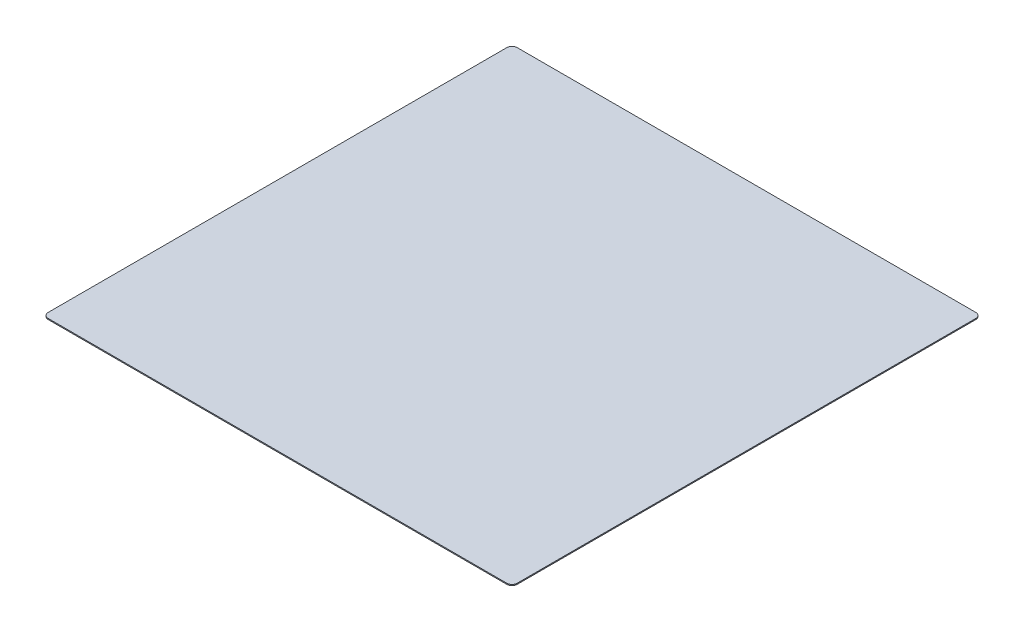
ISO-10303-21;
HEADER;
FILE_DESCRIPTION(('STEP AP214'),'2;1');
FILE_NAME('part.step','',(''),(''),'','','');
FILE_SCHEMA(('AUTOMOTIVE_DESIGN { 1 0 10303 214 1 1 1 1 }'));
ENDSEC;
DATA;
#1=APPLICATION_CONTEXT('core data for automotive mechanical design processes');
#2=APPLICATION_PROTOCOL_DEFINITION('international standard','automotive_design',2000,#1);
#3=PRODUCT_CONTEXT('',#1,'mechanical');
#4=PRODUCT('Part','Part','',(#3));
#5=PRODUCT_RELATED_PRODUCT_CATEGORY('part','',(#4));
#6=PRODUCT_DEFINITION_FORMATION('','',#4);
#7=PRODUCT_DEFINITION_CONTEXT('part definition',#1,'design');
#8=PRODUCT_DEFINITION('design','',#6,#7);
#9=PRODUCT_DEFINITION_SHAPE('','',#8);
#10=(LENGTH_UNIT() NAMED_UNIT(*) SI_UNIT(.MILLI.,.METRE.));
#11=(NAMED_UNIT(*) PLANE_ANGLE_UNIT() SI_UNIT($,.RADIAN.));
#12=(NAMED_UNIT(*) SI_UNIT($,.STERADIAN.) SOLID_ANGLE_UNIT());
#13=UNCERTAINTY_MEASURE_WITH_UNIT(LENGTH_MEASURE(1.E-05),#10,'distance_accuracy_value','');
#14=(GEOMETRIC_REPRESENTATION_CONTEXT(3) GLOBAL_UNCERTAINTY_ASSIGNED_CONTEXT((#13)) GLOBAL_UNIT_ASSIGNED_CONTEXT((#10,
#11,#12)) REPRESENTATION_CONTEXT('',''));
#15=CARTESIAN_POINT('',(0.,0.,0.));
#16=DIRECTION('',(0.,0.,1.));
#17=DIRECTION('',(1.,0.,0.));
#18=AXIS2_PLACEMENT_3D('',#15,#16,#17);
#19=CARTESIAN_POINT('',(68.349999952,0.15,68.349999952));
#20=DIRECTION('',(-1.,0.,0.));
#21=DIRECTION('',(0.,0.,1.));
#22=AXIS2_PLACEMENT_3D('',#19,#20,#21);
#23=PLANE('',#22);
#24=DIRECTION('',(0.,0.,-1.));
#25=VECTOR('',#24,1.);
#26=CARTESIAN_POINT('',(68.349999952,-0.15,68.349999952));
#27=LINE('',#26,#25);
#28=CARTESIAN_POINT('',(68.349999952,-0.15,66.849999952));
#29=VERTEX_POINT('',#28);
#30=CARTESIAN_POINT('',(68.349999952,-0.15,-66.849999952));
#31=VERTEX_POINT('',#30);
#32=EDGE_CURVE('E159',#29,#31,#27,.T.);
#33=ORIENTED_EDGE('',*,*,#32,.T.);
#34=DIRECTION('',(0.,-1.,0.));
#35=VECTOR('',#34,1.);
#36=CARTESIAN_POINT('',(68.349999952,0.15,-66.849999952));
#37=LINE('',#36,#35);
#38=CARTESIAN_POINT('',(68.349999952,0.15,-66.849999952));
#39=VERTEX_POINT('',#38);
#40=EDGE_CURVE('E11',#31,#39,#37,.F.);
#41=ORIENTED_EDGE('',*,*,#40,.T.);
#42=DIRECTION('',(0.,0.,-1.));
#43=VECTOR('',#42,1.);
#44=CARTESIAN_POINT('',(68.349999952,0.15,68.349999952));
#45=LINE('',#44,#43);
#46=CARTESIAN_POINT('',(68.349999952,0.15,66.849999952));
#47=VERTEX_POINT('',#46);
#48=EDGE_CURVE('E127',#47,#39,#45,.T.);
#49=ORIENTED_EDGE('',*,*,#48,.F.);
#50=DIRECTION('',(0.,-1.,0.));
#51=VECTOR('',#50,1.);
#52=CARTESIAN_POINT('',(68.349999952,0.15,66.849999952));
#53=LINE('',#52,#51);
#54=EDGE_CURVE('E43',#47,#29,#53,.T.);
#55=ORIENTED_EDGE('',*,*,#54,.T.);
#56=EDGE_LOOP('',(#33,#41,#49,#55));
#57=FACE_BOUND('',#56,.T.);
#58=ADVANCED_FACE('F35',(#57),#23,.F.);
#59=CARTESIAN_POINT('',(-68.349999952,0.15,-68.349999952));
#60=DIRECTION('',(0.,0.,1.));
#61=DIRECTION('',(1.,0.,0.));
#62=AXIS2_PLACEMENT_3D('',#59,#60,#61);
#63=PLANE('',#62);
#64=DIRECTION('',(-1.,0.,0.));
#65=VECTOR('',#64,1.);
#66=CARTESIAN_POINT('',(-68.349999952,-0.15,-68.349999952));
#67=LINE('',#66,#65);
#68=CARTESIAN_POINT('',(66.849999952,-0.15,-68.349999952));
#69=VERTEX_POINT('',#68);
#70=CARTESIAN_POINT('',(-66.849999952,-0.15,-68.349999952));
#71=VERTEX_POINT('',#70);
#72=EDGE_CURVE('E132',#69,#71,#67,.T.);
#73=ORIENTED_EDGE('',*,*,#72,.T.);
#74=DIRECTION('',(0.,-1.,0.));
#75=VECTOR('',#74,1.);
#76=CARTESIAN_POINT('',(-66.849999952,0.15,-68.349999952));
#77=LINE('',#76,#75);
#78=CARTESIAN_POINT('',(-66.849999952,0.15,-68.349999952));
#79=VERTEX_POINT('',#78);
#80=EDGE_CURVE('E50',#71,#79,#77,.F.);
#81=ORIENTED_EDGE('',*,*,#80,.T.);
#82=DIRECTION('',(-1.,0.,0.));
#83=VECTOR('',#82,1.);
#84=CARTESIAN_POINT('',(-68.349999952,0.15,-68.349999952));
#85=LINE('',#84,#83);
#86=CARTESIAN_POINT('',(66.849999952,0.15,-68.349999952));
#87=VERTEX_POINT('',#86);
#88=EDGE_CURVE('E130',#87,#79,#85,.T.);
#89=ORIENTED_EDGE('',*,*,#88,.F.);
#90=DIRECTION('',(0.,-1.,0.));
#91=VECTOR('',#90,1.);
#92=CARTESIAN_POINT('',(66.849999952,0.15,-68.349999952));
#93=LINE('',#92,#91);
#94=EDGE_CURVE('E151',#87,#69,#93,.T.);
#95=ORIENTED_EDGE('',*,*,#94,.T.);
#96=EDGE_LOOP('',(#73,#81,#89,#95));
#97=FACE_BOUND('',#96,.T.);
#98=ADVANCED_FACE('F179',(#97),#63,.F.);
#99=CARTESIAN_POINT('',(-68.349999952,0.15,68.349999952));
#100=DIRECTION('',(1.,0.,0.));
#101=DIRECTION('',(0.,0.,-1.));
#102=AXIS2_PLACEMENT_3D('',#99,#100,#101);
#103=PLANE('',#102);
#104=DIRECTION('',(0.,0.,1.));
#105=VECTOR('',#104,1.);
#106=CARTESIAN_POINT('',(-68.349999952,-0.15,68.349999952));
#107=LINE('',#106,#105);
#108=CARTESIAN_POINT('',(-68.349999952,-0.15,-66.849999952));
#109=VERTEX_POINT('',#108);
#110=CARTESIAN_POINT('',(-68.349999952,-0.15,66.849999952));
#111=VERTEX_POINT('',#110);
#112=EDGE_CURVE('E128',#109,#111,#107,.T.);
#113=ORIENTED_EDGE('',*,*,#112,.T.);
#114=DIRECTION('',(0.,-1.,0.));
#115=VECTOR('',#114,1.);
#116=CARTESIAN_POINT('',(-68.349999952,0.15,66.849999952));
#117=LINE('',#116,#115);
#118=CARTESIAN_POINT('',(-68.349999952,0.15,66.849999952));
#119=VERTEX_POINT('',#118);
#120=EDGE_CURVE('E106',#111,#119,#117,.F.);
#121=ORIENTED_EDGE('',*,*,#120,.T.);
#122=DIRECTION('',(0.,0.,1.));
#123=VECTOR('',#122,1.);
#124=CARTESIAN_POINT('',(-68.349999952,0.15,68.349999952));
#125=LINE('',#124,#123);
#126=CARTESIAN_POINT('',(-68.349999952,0.15,-66.849999952));
#127=VERTEX_POINT('',#126);
#128=EDGE_CURVE('E167',#127,#119,#125,.T.);
#129=ORIENTED_EDGE('',*,*,#128,.F.);
#130=DIRECTION('',(0.,-1.,0.));
#131=VECTOR('',#130,1.);
#132=CARTESIAN_POINT('',(-68.349999952,0.15,-66.849999952));
#133=LINE('',#132,#131);
#134=EDGE_CURVE('E111',#127,#109,#133,.T.);
#135=ORIENTED_EDGE('',*,*,#134,.T.);
#136=EDGE_LOOP('',(#113,#121,#129,#135));
#137=FACE_BOUND('',#136,.T.);
#138=ADVANCED_FACE('F178',(#137),#103,.F.);
#139=CARTESIAN_POINT('',(-68.349999952,0.15,68.349999952));
#140=DIRECTION('',(0.,0.,-1.));
#141=DIRECTION('',(-1.,0.,0.));
#142=AXIS2_PLACEMENT_3D('',#139,#140,#141);
#143=PLANE('',#142);
#144=DIRECTION('',(1.,0.,0.));
#145=VECTOR('',#144,1.);
#146=CARTESIAN_POINT('',(-68.349999952,0.15,68.349999952));
#147=LINE('',#146,#145);
#148=CARTESIAN_POINT('',(-66.849999952,0.15,68.349999952));
#149=VERTEX_POINT('',#148);
#150=CARTESIAN_POINT('',(66.849999952,0.15,68.349999952));
#151=VERTEX_POINT('',#150);
#152=EDGE_CURVE('E121',#149,#151,#147,.T.);
#153=ORIENTED_EDGE('',*,*,#152,.F.);
#154=DIRECTION('',(0.,-1.,0.));
#155=VECTOR('',#154,1.);
#156=CARTESIAN_POINT('',(-66.849999952,0.15,68.349999952));
#157=LINE('',#156,#155);
#158=CARTESIAN_POINT('',(-66.849999952,-0.15,68.349999952));
#159=VERTEX_POINT('',#158);
#160=EDGE_CURVE('E105',#149,#159,#157,.T.);
#161=ORIENTED_EDGE('',*,*,#160,.T.);
#162=DIRECTION('',(1.,0.,0.));
#163=VECTOR('',#162,1.);
#164=CARTESIAN_POINT('',(-68.349999952,-0.15,68.349999952));
#165=LINE('',#164,#163);
#166=CARTESIAN_POINT('',(66.849999952,-0.15,68.349999952));
#167=VERTEX_POINT('',#166);
#168=EDGE_CURVE('E118',#159,#167,#165,.T.);
#169=ORIENTED_EDGE('',*,*,#168,.T.);
#170=DIRECTION('',(0.,-1.,0.));
#171=VECTOR('',#170,1.);
#172=CARTESIAN_POINT('',(66.849999952,0.15,68.349999952));
#173=LINE('',#172,#171);
#174=EDGE_CURVE('E123',#167,#151,#173,.F.);
#175=ORIENTED_EDGE('',*,*,#174,.T.);
#176=EDGE_LOOP('',(#153,#161,#169,#175));
#177=FACE_BOUND('',#176,.T.);
#178=ADVANCED_FACE('F117',(#177),#143,.F.);
#179=CARTESIAN_POINT('',(0.,0.15,0.));
#180=DIRECTION('',(0.,-1.,0.));
#181=DIRECTION('',(0.,0.,-1.));
#182=AXIS2_PLACEMENT_3D('',#179,#180,#181);
#183=PLANE('',#182);
#184=ORIENTED_EDGE('',*,*,#128,.T.);
#185=CARTESIAN_POINT('',(-66.849999952,0.15,66.849999952));
#186=DIRECTION('',(0.,-1.,0.));
#187=DIRECTION('',(0.,0.,-1.));
#188=AXIS2_PLACEMENT_3D('',#185,#186,#187);
#189=CIRCLE('',#188,1.5);
#190=EDGE_CURVE('E149',#119,#149,#189,.F.);
#191=ORIENTED_EDGE('',*,*,#190,.T.);
#192=ORIENTED_EDGE('',*,*,#152,.T.);
#193=CARTESIAN_POINT('',(66.849999952,0.15,66.849999952));
#194=DIRECTION('',(0.,-1.,0.));
#195=DIRECTION('',(0.,0.,-1.));
#196=AXIS2_PLACEMENT_3D('',#193,#194,#195);
#197=CIRCLE('',#196,1.5);
#198=EDGE_CURVE('E144',#151,#47,#197,.F.);
#199=ORIENTED_EDGE('',*,*,#198,.T.);
#200=ORIENTED_EDGE('',*,*,#48,.T.);
#201=CARTESIAN_POINT('',(66.849999952,0.15,-66.849999952));
#202=DIRECTION('',(0.,-1.,0.));
#203=DIRECTION('',(0.,0.,-1.));
#204=AXIS2_PLACEMENT_3D('',#201,#202,#203);
#205=CIRCLE('',#204,1.5);
#206=EDGE_CURVE('E57',#39,#87,#205,.F.);
#207=ORIENTED_EDGE('',*,*,#206,.T.);
#208=ORIENTED_EDGE('',*,*,#88,.T.);
#209=CARTESIAN_POINT('',(-66.849999952,0.15,-66.849999952));
#210=DIRECTION('',(0.,-1.,0.));
#211=DIRECTION('',(0.,0.,-1.));
#212=AXIS2_PLACEMENT_3D('',#209,#210,#211);
#213=CIRCLE('',#212,1.5);
#214=EDGE_CURVE('E147',#79,#127,#213,.F.);
#215=ORIENTED_EDGE('',*,*,#214,.T.);
#216=EDGE_LOOP('',(#184,#191,#192,#199,#200,#207,#208,#215));
#217=FACE_BOUND('',#216,.T.);
#218=ADVANCED_FACE('F171',(#217),#183,.F.);
#219=CARTESIAN_POINT('',(0.,-0.15,0.));
#220=DIRECTION('',(0.,-1.,0.));
#221=DIRECTION('',(0.,0.,-1.));
#222=AXIS2_PLACEMENT_3D('',#219,#220,#221);
#223=PLANE('',#222);
#224=ORIENTED_EDGE('',*,*,#168,.F.);
#225=CARTESIAN_POINT('',(-66.849999952,-0.15,66.849999952));
#226=DIRECTION('',(0.,-1.,0.));
#227=DIRECTION('',(0.,0.,-1.));
#228=AXIS2_PLACEMENT_3D('',#225,#226,#227);
#229=CIRCLE('',#228,1.5);
#230=EDGE_CURVE('E101',#159,#111,#229,.T.);
#231=ORIENTED_EDGE('',*,*,#230,.T.);
#232=ORIENTED_EDGE('',*,*,#112,.F.);
#233=CARTESIAN_POINT('',(-66.849999952,-0.15,-66.849999952));
#234=DIRECTION('',(0.,-1.,0.));
#235=DIRECTION('',(0.,0.,-1.));
#236=AXIS2_PLACEMENT_3D('',#233,#234,#235);
#237=CIRCLE('',#236,1.5);
#238=EDGE_CURVE('E112',#109,#71,#237,.T.);
#239=ORIENTED_EDGE('',*,*,#238,.T.);
#240=ORIENTED_EDGE('',*,*,#72,.F.);
#241=CARTESIAN_POINT('',(66.849999952,-0.15,-66.849999952));
#242=DIRECTION('',(0.,-1.,0.));
#243=DIRECTION('',(0.,0.,-1.));
#244=AXIS2_PLACEMENT_3D('',#241,#242,#243);
#245=CIRCLE('',#244,1.5);
#246=EDGE_CURVE('E138',#69,#31,#245,.T.);
#247=ORIENTED_EDGE('',*,*,#246,.T.);
#248=ORIENTED_EDGE('',*,*,#32,.F.);
#249=CARTESIAN_POINT('',(66.849999952,-0.15,66.849999952));
#250=DIRECTION('',(0.,-1.,0.));
#251=DIRECTION('',(0.,0.,-1.));
#252=AXIS2_PLACEMENT_3D('',#249,#250,#251);
#253=CIRCLE('',#252,1.5);
#254=EDGE_CURVE('E122',#29,#167,#253,.T.);
#255=ORIENTED_EDGE('',*,*,#254,.T.);
#256=EDGE_LOOP('',(#224,#231,#232,#239,#240,#247,#248,#255));
#257=FACE_BOUND('',#256,.T.);
#258=ADVANCED_FACE('F125',(#257),#223,.T.);
#259=CARTESIAN_POINT('',(-66.849999952,0.15,66.849999952));
#260=DIRECTION('',(0.,-1.,0.));
#261=DIRECTION('',(0.,0.,-1.));
#262=AXIS2_PLACEMENT_3D('',#259,#260,#261);
#263=CYLINDRICAL_SURFACE('',#262,1.5);
#264=ORIENTED_EDGE('',*,*,#190,.F.);
#265=ORIENTED_EDGE('',*,*,#120,.F.);
#266=ORIENTED_EDGE('',*,*,#230,.F.);
#267=ORIENTED_EDGE('',*,*,#160,.F.);
#268=EDGE_LOOP('',(#264,#265,#266,#267));
#269=FACE_BOUND('',#268,.T.);
#270=ADVANCED_FACE('F104',(#269),#263,.T.);
#271=CARTESIAN_POINT('',(-66.849999952,0.15,-66.849999952));
#272=DIRECTION('',(0.,-1.,0.));
#273=DIRECTION('',(0.,0.,-1.));
#274=AXIS2_PLACEMENT_3D('',#271,#272,#273);
#275=CYLINDRICAL_SURFACE('',#274,1.5);
#276=ORIENTED_EDGE('',*,*,#214,.F.);
#277=ORIENTED_EDGE('',*,*,#80,.F.);
#278=ORIENTED_EDGE('',*,*,#238,.F.);
#279=ORIENTED_EDGE('',*,*,#134,.F.);
#280=EDGE_LOOP('',(#276,#277,#278,#279));
#281=FACE_BOUND('',#280,.T.);
#282=ADVANCED_FACE('F176',(#281),#275,.T.);
#283=CARTESIAN_POINT('',(66.849999952,0.15,-66.849999952));
#284=DIRECTION('',(0.,-1.,0.));
#285=DIRECTION('',(0.,0.,-1.));
#286=AXIS2_PLACEMENT_3D('',#283,#284,#285);
#287=CYLINDRICAL_SURFACE('',#286,1.5);
#288=ORIENTED_EDGE('',*,*,#206,.F.);
#289=ORIENTED_EDGE('',*,*,#40,.F.);
#290=ORIENTED_EDGE('',*,*,#246,.F.);
#291=ORIENTED_EDGE('',*,*,#94,.F.);
#292=EDGE_LOOP('',(#288,#289,#290,#291));
#293=FACE_BOUND('',#292,.T.);
#294=ADVANCED_FACE('F181',(#293),#287,.T.);
#295=CARTESIAN_POINT('',(66.849999952,0.15,66.849999952));
#296=DIRECTION('',(0.,-1.,0.));
#297=DIRECTION('',(0.,0.,-1.));
#298=AXIS2_PLACEMENT_3D('',#295,#296,#297);
#299=CYLINDRICAL_SURFACE('',#298,1.5);
#300=ORIENTED_EDGE('',*,*,#198,.F.);
#301=ORIENTED_EDGE('',*,*,#174,.F.);
#302=ORIENTED_EDGE('',*,*,#254,.F.);
#303=ORIENTED_EDGE('',*,*,#54,.F.);
#304=EDGE_LOOP('',(#300,#301,#302,#303));
#305=FACE_BOUND('',#304,.T.);
#306=ADVANCED_FACE('F37',(#305),#299,.T.);
#307=CLOSED_SHELL('',(#58,#98,#138,#178,#218,#258,#270,#282,#294,#306));
#308=MANIFOLD_SOLID_BREP('B2',#307);
#309=ADVANCED_BREP_SHAPE_REPRESENTATION('',(#18,#308),#14);
#310=SHAPE_DEFINITION_REPRESENTATION(#9,#309);
ENDSEC;
END-ISO-10303-21;
